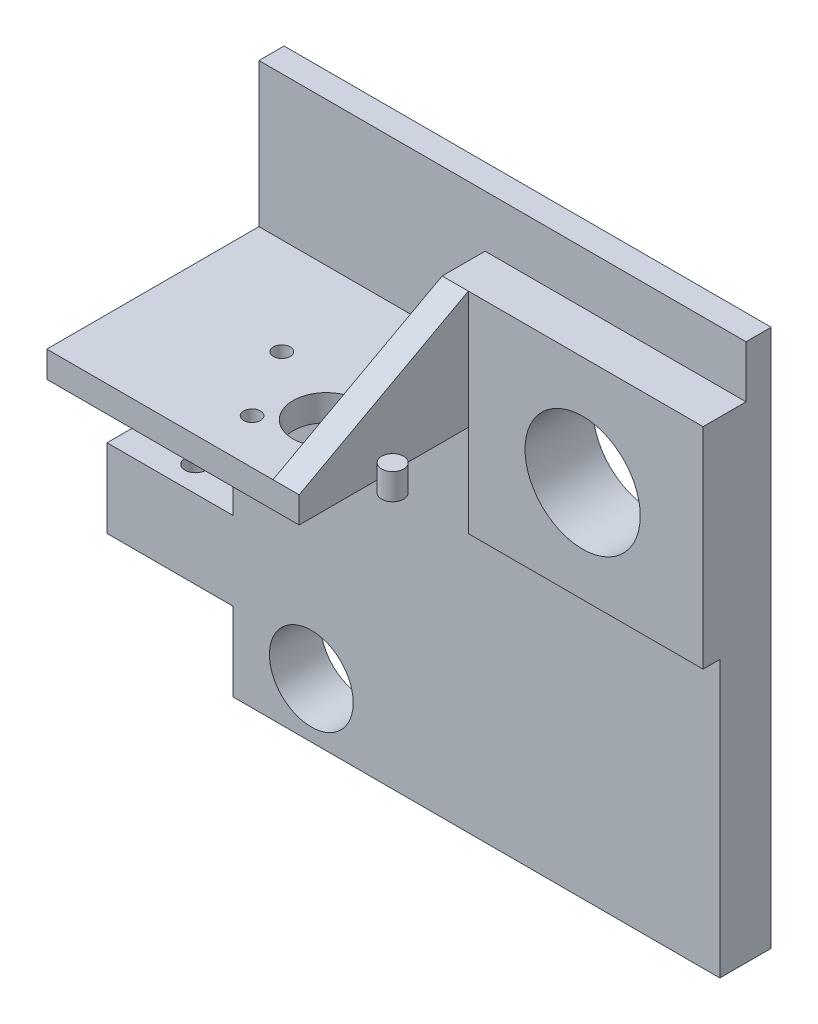
ISO-10303-21;
HEADER;
FILE_DESCRIPTION(('STEP AP214'),'2;1');
FILE_NAME('part.step','',(''),(''),'','','');
FILE_SCHEMA(('AUTOMOTIVE_DESIGN { 1 0 10303 214 1 1 1 1 }'));
ENDSEC;
DATA;
#1=APPLICATION_CONTEXT('core data for automotive mechanical design processes');
#2=APPLICATION_PROTOCOL_DEFINITION('international standard','automotive_design',2000,#1);
#3=PRODUCT_CONTEXT('',#1,'mechanical');
#4=PRODUCT('Part','Part','',(#3));
#5=PRODUCT_RELATED_PRODUCT_CATEGORY('part','',(#4));
#6=PRODUCT_DEFINITION_FORMATION('','',#4);
#7=PRODUCT_DEFINITION_CONTEXT('part definition',#1,'design');
#8=PRODUCT_DEFINITION('design','',#6,#7);
#9=PRODUCT_DEFINITION_SHAPE('','',#8);
#10=(LENGTH_UNIT() NAMED_UNIT(*) SI_UNIT(.MILLI.,.METRE.));
#11=(NAMED_UNIT(*) PLANE_ANGLE_UNIT() SI_UNIT($,.RADIAN.));
#12=(NAMED_UNIT(*) SI_UNIT($,.STERADIAN.) SOLID_ANGLE_UNIT());
#13=UNCERTAINTY_MEASURE_WITH_UNIT(LENGTH_MEASURE(1.E-05),#10,'distance_accuracy_value','');
#14=(GEOMETRIC_REPRESENTATION_CONTEXT(3) GLOBAL_UNCERTAINTY_ASSIGNED_CONTEXT((#13)) GLOBAL_UNIT_ASSIGNED_CONTEXT((#10,
#11,#12)) REPRESENTATION_CONTEXT('',''));
#15=CARTESIAN_POINT('',(0.,0.,0.));
#16=DIRECTION('',(0.,0.,1.));
#17=DIRECTION('',(1.,0.,0.));
#18=AXIS2_PLACEMENT_3D('',#15,#16,#17);
#19=CARTESIAN_POINT('',(51.783815806264,70.2347169301738,31.0499999999999));
#20=DIRECTION('',(0.,1.,0.));
#21=DIRECTION('',(0.,0.,1.));
#22=AXIS2_PLACEMENT_3D('',#19,#20,#21);
#23=CYLINDRICAL_SURFACE('',#22,2.1);
#24=CARTESIAN_POINT('',(51.783815806264,70.2347169301738,31.0499999999999));
#25=DIRECTION('',(0.,-1.,0.));
#26=DIRECTION('',(0.,0.,-1.));
#27=AXIS2_PLACEMENT_3D('',#24,#25,#26);
#28=CIRCLE('',#27,2.1);
#29=CARTESIAN_POINT('',(51.783815806264,70.2347169301738,28.9499999999999));
#30=VERTEX_POINT('',#29);
#31=EDGE_CURVE('E11',#30,#30,#28,.F.);
#32=ORIENTED_EDGE('',*,*,#31,.T.);
#33=EDGE_LOOP('',(#32));
#34=FACE_BOUND('',#33,.T.);
#35=CARTESIAN_POINT('',(51.783815806264,75.2347169301738,31.0499999999999));
#36=DIRECTION('',(0.,-1.,0.));
#37=DIRECTION('',(0.,0.,-1.));
#38=AXIS2_PLACEMENT_3D('',#35,#36,#37);
#39=CIRCLE('',#38,2.1);
#40=CARTESIAN_POINT('',(51.783815806264,75.2347169301738,28.9499999999999));
#41=VERTEX_POINT('',#40);
#42=EDGE_CURVE('E46',#41,#41,#39,.F.);
#43=ORIENTED_EDGE('',*,*,#42,.F.);
#44=EDGE_LOOP('',(#43));
#45=FACE_BOUND('',#44,.T.);
#46=ADVANCED_FACE('F43',(#34,#45),#23,.T.);
#47=CARTESIAN_POINT('',(0.,70.2347169301738,0.));
#48=DIRECTION('',(0.,-1.,0.));
#49=DIRECTION('',(0.,0.,-1.));
#50=AXIS2_PLACEMENT_3D('',#47,#48,#49);
#51=PLANE('',#50);
#52=ORIENTED_EDGE('',*,*,#31,.F.);
#53=EDGE_LOOP('',(#52));
#54=FACE_BOUND('',#53,.T.);
#55=ADVANCED_FACE('F58',(#54),#51,.T.);
#56=CARTESIAN_POINT('',(0.,75.2347169301738,0.));
#57=DIRECTION('',(0.,-1.,0.));
#58=DIRECTION('',(0.,0.,-1.));
#59=AXIS2_PLACEMENT_3D('',#56,#57,#58);
#60=PLANE('',#59);
#61=ORIENTED_EDGE('',*,*,#42,.T.);
#62=EDGE_LOOP('',(#61));
#63=FACE_BOUND('',#62,.T.);
#64=ADVANCED_FACE('F55',(#63),#60,.F.);
#65=CLOSED_SHELL('',(#46,#55,#64));
#66=MANIFOLD_SOLID_BREP('B2',#65);
#67=CARTESIAN_POINT('',(0.,0.,4.8));
#68=DIRECTION('',(0.,0.,1.));
#69=DIRECTION('',(1.,0.,0.));
#70=AXIS2_PLACEMENT_3D('',#67,#68,#69);
#71=PLANE('',#70);
#72=DIRECTION('',(0.,1.,0.));
#73=VECTOR('',#72,1.);
#74=CARTESIAN_POINT('',(43.1785673072466,92.7631774285374,4.80000000000001));
#75=LINE('',#74,#73);
#76=CARTESIAN_POINT('',(43.1785673072466,75.2347169301738,4.80000000000001));
#77=VERTEX_POINT('',#76);
#78=CARTESIAN_POINT('',(43.1785673072466,92.7631774285374,4.80000000000001));
#79=VERTEX_POINT('',#78);
#80=EDGE_CURVE('E253',#77,#79,#75,.T.);
#81=ORIENTED_EDGE('',*,*,#80,.T.);
#82=DIRECTION('',(1.,0.,0.));
#83=VECTOR('',#82,1.);
#84=CARTESIAN_POINT('',(0.,92.7631774285374,4.8));
#85=LINE('',#84,#83);
#86=CARTESIAN_POINT('',(93.,92.7631774285374,4.79999999999999));
#87=VERTEX_POINT('',#86);
#88=EDGE_CURVE('E321',#79,#87,#85,.T.);
#89=ORIENTED_EDGE('',*,*,#88,.T.);
#90=DIRECTION('',(0.,1.,0.));
#91=VECTOR('',#90,1.);
#92=CARTESIAN_POINT('',(93.0000000000001,0.,4.79999999999999));
#93=LINE('',#92,#91);
#94=CARTESIAN_POINT('',(93.,102.7,4.8));
#95=VERTEX_POINT('',#94);
#96=EDGE_CURVE('E346',#87,#95,#93,.T.);
#97=ORIENTED_EDGE('',*,*,#96,.T.);
#98=DIRECTION('',(-1.,0.,0.));
#99=VECTOR('',#98,1.);
#100=CARTESIAN_POINT('',(0.,102.7,4.8));
#101=LINE('',#100,#99);
#102=CARTESIAN_POINT('',(0.,102.7,4.8));
#103=VERTEX_POINT('',#102);
#104=EDGE_CURVE('E348',#95,#103,#101,.T.);
#105=ORIENTED_EDGE('',*,*,#104,.T.);
#106=DIRECTION('',(0.,-1.,0.));
#107=VECTOR('',#106,1.);
#108=CARTESIAN_POINT('',(0.,0.,4.8));
#109=LINE('',#108,#107);
#110=CARTESIAN_POINT('',(0.,75.2347169301738,4.80000000000001));
#111=VERTEX_POINT('',#110);
#112=EDGE_CURVE('E351',#103,#111,#109,.T.);
#113=ORIENTED_EDGE('',*,*,#112,.T.);
#114=DIRECTION('',(1.,0.,0.));
#115=VECTOR('',#114,1.);
#116=CARTESIAN_POINT('',(0.,75.2347169301738,4.80000000000001));
#117=LINE('',#116,#115);
#118=EDGE_CURVE('E278',#111,#77,#117,.T.);
#119=ORIENTED_EDGE('',*,*,#118,.T.);
#120=EDGE_LOOP('',(#81,#89,#97,#105,#113,#119));
#121=FACE_BOUND('',#120,.T.);
#122=ADVANCED_FACE('F84',(#121),#71,.T.);
#123=CARTESIAN_POINT('',(0.,0.,4.8));
#124=DIRECTION('',(1.,0.,0.));
#125=DIRECTION('',(0.,1.,0.));
#126=AXIS2_PLACEMENT_3D('',#123,#124,#125);
#127=PLANE('',#126);
#128=DIRECTION('',(0.,-1.,0.));
#129=VECTOR('',#128,1.);
#130=CARTESIAN_POINT('',(0.,0.,0.));
#131=LINE('',#130,#129);
#132=CARTESIAN_POINT('',(0.,15.,0.));
#133=VERTEX_POINT('',#132);
#134=CARTESIAN_POINT('',(0.,0.,0.));
#135=VERTEX_POINT('',#134);
#136=EDGE_CURVE('E345',#133,#135,#131,.T.);
#137=ORIENTED_EDGE('',*,*,#136,.T.);
#138=DIRECTION('',(0.,0.,-1.));
#139=VECTOR('',#138,1.);
#140=CARTESIAN_POINT('',(0.,0.,4.8));
#141=LINE('',#140,#139);
#142=CARTESIAN_POINT('',(0.,0.,9.8));
#143=VERTEX_POINT('',#142);
#144=EDGE_CURVE('E394',#143,#135,#141,.T.);
#145=ORIENTED_EDGE('',*,*,#144,.F.);
#146=DIRECTION('',(0.,-1.,0.));
#147=VECTOR('',#146,1.);
#148=CARTESIAN_POINT('',(0.,0.,9.8));
#149=LINE('',#148,#147);
#150=CARTESIAN_POINT('',(0.,15.,9.8));
#151=VERTEX_POINT('',#150);
#152=EDGE_CURVE('E230',#151,#143,#149,.T.);
#153=ORIENTED_EDGE('',*,*,#152,.F.);
#154=DIRECTION('',(0.,0.,-1.));
#155=VECTOR('',#154,1.);
#156=CARTESIAN_POINT('',(0.,15.,4.8));
#157=LINE('',#156,#155);
#158=EDGE_CURVE('E354',#151,#133,#157,.T.);
#159=ORIENTED_EDGE('',*,*,#158,.T.);
#160=EDGE_LOOP('',(#137,#145,#153,#159));
#161=FACE_BOUND('',#160,.T.);
#162=ADVANCED_FACE('F86',(#161),#127,.F.);
#163=CARTESIAN_POINT('',(0.,0.,4.8));
#164=DIRECTION('',(0.,1.,0.));
#165=DIRECTION('',(-1.,0.,0.));
#166=AXIS2_PLACEMENT_3D('',#163,#164,#165);
#167=PLANE('',#166);
#168=DIRECTION('',(1.,0.,0.));
#169=VECTOR('',#168,1.);
#170=CARTESIAN_POINT('',(0.,0.,0.));
#171=LINE('',#170,#169);
#172=CARTESIAN_POINT('',(93.0000000000001,0.,0.));
#173=VERTEX_POINT('',#172);
#174=EDGE_CURVE('E357',#135,#173,#171,.T.);
#175=ORIENTED_EDGE('',*,*,#174,.T.);
#176=DIRECTION('',(0.,0.,-1.));
#177=VECTOR('',#176,1.);
#178=CARTESIAN_POINT('',(93.0000000000001,0.,4.79999999999999));
#179=LINE('',#178,#177);
#180=CARTESIAN_POINT('',(93.0000000000004,0.,9.8));
#181=VERTEX_POINT('',#180);
#182=EDGE_CURVE('E391',#181,#173,#179,.T.);
#183=ORIENTED_EDGE('',*,*,#182,.F.);
#184=DIRECTION('',(1.00000000000001,0.,0.));
#185=VECTOR('',#184,1.);
#186=CARTESIAN_POINT('',(0.,0.,9.8));
#187=LINE('',#186,#185);
#188=EDGE_CURVE('E310',#143,#181,#187,.T.);
#189=ORIENTED_EDGE('',*,*,#188,.F.);
#190=ORIENTED_EDGE('',*,*,#144,.T.);
#191=EDGE_LOOP('',(#175,#183,#189,#190));
#192=FACE_BOUND('',#191,.T.);
#193=ADVANCED_FACE('F456',(#192),#167,.F.);
#194=CARTESIAN_POINT('',(93.0000000000001,0.,4.79999999999999));
#195=DIRECTION('',(-1.,0.,0.));
#196=DIRECTION('',(0.,-1.,0.));
#197=AXIS2_PLACEMENT_3D('',#194,#195,#196);
#198=PLANE('',#197);
#199=DIRECTION('',(0.,1.,0.));
#200=VECTOR('',#199,1.);
#201=CARTESIAN_POINT('',(93.0000000000001,0.,0.));
#202=LINE('',#201,#200);
#203=CARTESIAN_POINT('',(93.,102.7,0.));
#204=VERTEX_POINT('',#203);
#205=EDGE_CURVE('E359',#173,#204,#202,.T.);
#206=ORIENTED_EDGE('',*,*,#205,.T.);
#207=DIRECTION('',(0.,0.,-1.));
#208=VECTOR('',#207,1.);
#209=CARTESIAN_POINT('',(93.,102.7,4.8));
#210=LINE('',#209,#208);
#211=EDGE_CURVE('E388',#95,#204,#210,.T.);
#212=ORIENTED_EDGE('',*,*,#211,.F.);
#213=ORIENTED_EDGE('',*,*,#96,.F.);
#214=DIRECTION('',(0.,0.,-1.));
#215=VECTOR('',#214,1.);
#216=CARTESIAN_POINT('',(93.0000000000001,92.7631774285374,13.));
#217=LINE('',#216,#215);
#218=CARTESIAN_POINT('',(93.0000000000001,92.7631774285374,13.));
#219=VERTEX_POINT('',#218);
#220=EDGE_CURVE('E335',#219,#87,#217,.T.);
#221=ORIENTED_EDGE('',*,*,#220,.F.);
#222=DIRECTION('',(0.,1.,0.));
#223=VECTOR('',#222,1.);
#224=CARTESIAN_POINT('',(93.0000000000001,0.,13.));
#225=LINE('',#224,#223);
#226=CARTESIAN_POINT('',(93.0000000000001,52.6660119943756,13.));
#227=VERTEX_POINT('',#226);
#228=EDGE_CURVE('E330',#227,#219,#225,.T.);
#229=ORIENTED_EDGE('',*,*,#228,.F.);
#230=DIRECTION('',(0.,0.,-1.));
#231=VECTOR('',#230,1.);
#232=CARTESIAN_POINT('',(93.0000000000001,52.6660119943756,13.));
#233=LINE('',#232,#231);
#234=CARTESIAN_POINT('',(93.0000000000001,52.6660119943756,9.8));
#235=VERTEX_POINT('',#234);
#236=EDGE_CURVE('E339',#227,#235,#233,.T.);
#237=ORIENTED_EDGE('',*,*,#236,.T.);
#238=DIRECTION('',(0.,1.,0.));
#239=VECTOR('',#238,1.);
#240=CARTESIAN_POINT('',(93.0000000000004,0.,9.8));
#241=LINE('',#240,#239);
#242=EDGE_CURVE('E228',#181,#235,#241,.T.);
#243=ORIENTED_EDGE('',*,*,#242,.F.);
#244=ORIENTED_EDGE('',*,*,#182,.T.);
#245=EDGE_LOOP('',(#206,#212,#213,#221,#229,#237,#243,#244));
#246=FACE_BOUND('',#245,.T.);
#247=ADVANCED_FACE('F491',(#246),#198,.F.);
#248=CARTESIAN_POINT('',(0.,102.7,4.8));
#249=DIRECTION('',(0.,-1.,0.));
#250=DIRECTION('',(1.,0.,0.));
#251=AXIS2_PLACEMENT_3D('',#248,#249,#250);
#252=PLANE('',#251);
#253=DIRECTION('',(-1.,0.,0.));
#254=VECTOR('',#253,1.);
#255=CARTESIAN_POINT('',(0.,102.7,0.));
#256=LINE('',#255,#254);
#257=CARTESIAN_POINT('',(0.,102.7,0.));
#258=VERTEX_POINT('',#257);
#259=EDGE_CURVE('E361',#204,#258,#256,.T.);
#260=ORIENTED_EDGE('',*,*,#259,.T.);
#261=DIRECTION('',(0.,0.,-1.));
#262=VECTOR('',#261,1.);
#263=CARTESIAN_POINT('',(0.,102.7,4.8));
#264=LINE('',#263,#262);
#265=EDGE_CURVE('E385',#103,#258,#264,.T.);
#266=ORIENTED_EDGE('',*,*,#265,.F.);
#267=ORIENTED_EDGE('',*,*,#104,.F.);
#268=ORIENTED_EDGE('',*,*,#211,.T.);
#269=EDGE_LOOP('',(#260,#266,#267,#268));
#270=FACE_BOUND('',#269,.T.);
#271=ADVANCED_FACE('F488',(#270),#252,.F.);
#272=CARTESIAN_POINT('',(0.,0.,4.8));
#273=DIRECTION('',(1.,0.,0.));
#274=DIRECTION('',(0.,1.,0.));
#275=AXIS2_PLACEMENT_3D('',#272,#273,#274);
#276=PLANE('',#275);
#277=DIRECTION('',(0.,-1.,0.));
#278=VECTOR('',#277,1.);
#279=CARTESIAN_POINT('',(0.,0.,0.));
#280=LINE('',#279,#278);
#281=CARTESIAN_POINT('',(0.,30.,0.));
#282=VERTEX_POINT('',#281);
#283=EDGE_CURVE('E363',#258,#282,#280,.T.);
#284=ORIENTED_EDGE('',*,*,#283,.T.);
#285=DIRECTION('',(0.,0.,-1.));
#286=VECTOR('',#285,1.);
#287=CARTESIAN_POINT('',(0.,30.,4.8));
#288=LINE('',#287,#286);
#289=CARTESIAN_POINT('',(0.,30.,9.8));
#290=VERTEX_POINT('',#289);
#291=EDGE_CURVE('E223',#290,#282,#288,.T.);
#292=ORIENTED_EDGE('',*,*,#291,.F.);
#293=CARTESIAN_POINT('',(0.,70.2347169301738,9.8));
#294=VERTEX_POINT('',#293);
#295=EDGE_CURVE('E218',#294,#290,#149,.T.);
#296=ORIENTED_EDGE('',*,*,#295,.F.);
#297=DIRECTION('',(0.,0.,1.));
#298=VECTOR('',#297,1.);
#299=CARTESIAN_POINT('',(0.,70.2347169301738,0.));
#300=LINE('',#299,#298);
#301=CARTESIAN_POINT('',(0.,70.2347169301738,45.3));
#302=VERTEX_POINT('',#301);
#303=EDGE_CURVE('E220',#294,#302,#300,.T.);
#304=ORIENTED_EDGE('',*,*,#303,.T.);
#305=DIRECTION('',(0.,1.,0.));
#306=VECTOR('',#305,1.);
#307=CARTESIAN_POINT('',(0.,70.2347169301738,45.3));
#308=LINE('',#307,#306);
#309=CARTESIAN_POINT('',(0.,75.2347169301738,45.3));
#310=VERTEX_POINT('',#309);
#311=EDGE_CURVE('E235',#302,#310,#308,.T.);
#312=ORIENTED_EDGE('',*,*,#311,.T.);
#313=DIRECTION('',(0.,0.,1.));
#314=VECTOR('',#313,1.);
#315=CARTESIAN_POINT('',(0.,75.2347169301738,0.));
#316=LINE('',#315,#314);
#317=EDGE_CURVE('E298',#111,#310,#316,.T.);
#318=ORIENTED_EDGE('',*,*,#317,.F.);
#319=ORIENTED_EDGE('',*,*,#112,.F.);
#320=ORIENTED_EDGE('',*,*,#265,.T.);
#321=EDGE_LOOP('',(#284,#292,#296,#304,#312,#318,#319,#320));
#322=FACE_BOUND('',#321,.T.);
#323=ADVANCED_FACE('F219',(#322),#276,.F.);
#324=CARTESIAN_POINT('',(1.21430643317358E-13,30.,4.8));
#325=DIRECTION('',(0.,-1.,0.));
#326=DIRECTION('',(1.,0.,0.));
#327=AXIS2_PLACEMENT_3D('',#324,#325,#326);
#328=PLANE('',#327);
#329=CARTESIAN_POINT('',(-11.9999999999999,30.0000000000001,4.9));
#330=DIRECTION('',(0.,1.,0.));
#331=DIRECTION('',(-1.,0.,0.));
#332=AXIS2_PLACEMENT_3D('',#329,#330,#331);
#333=CIRCLE('',#332,2.);
#334=CARTESIAN_POINT('',(-13.9999999999999,30.0000000000001,4.9));
#335=VERTEX_POINT('',#334);
#336=EDGE_CURVE('E247',#335,#335,#333,.T.);
#337=ORIENTED_EDGE('',*,*,#336,.F.);
#338=EDGE_LOOP('',(#337));
#339=FACE_BOUND('',#338,.T.);
#340=DIRECTION('',(-1.,0.,0.));
#341=VECTOR('',#340,1.);
#342=CARTESIAN_POINT('',(1.21430643317358E-13,30.,0.));
#343=LINE('',#342,#341);
#344=CARTESIAN_POINT('',(-24.,30.0000000000001,0.));
#345=VERTEX_POINT('',#344);
#346=EDGE_CURVE('E365',#282,#345,#343,.T.);
#347=ORIENTED_EDGE('',*,*,#346,.T.);
#348=DIRECTION('',(0.,0.,-1.));
#349=VECTOR('',#348,1.);
#350=CARTESIAN_POINT('',(-24.,30.0000000000001,4.8));
#351=LINE('',#350,#349);
#352=CARTESIAN_POINT('',(-24.,30.0000000000001,9.8));
#353=VERTEX_POINT('',#352);
#354=EDGE_CURVE('E381',#353,#345,#351,.T.);
#355=ORIENTED_EDGE('',*,*,#354,.F.);
#356=DIRECTION('',(-1.,0.,0.));
#357=VECTOR('',#356,1.);
#358=CARTESIAN_POINT('',(1.21430643318376E-13,30.,9.8));
#359=LINE('',#358,#357);
#360=EDGE_CURVE('E227',#290,#353,#359,.T.);
#361=ORIENTED_EDGE('',*,*,#360,.F.);
#362=ORIENTED_EDGE('',*,*,#291,.T.);
#363=EDGE_LOOP('',(#347,#355,#361,#362));
#364=FACE_BOUND('',#363,.T.);
#365=ADVANCED_FACE('F481',(#339,#364),#328,.F.);
#366=CARTESIAN_POINT('',(-23.9999999999999,0.,4.8));
#367=DIRECTION('',(1.,0.,0.));
#368=DIRECTION('',(0.,1.,0.));
#369=AXIS2_PLACEMENT_3D('',#366,#367,#368);
#370=PLANE('',#369);
#371=DIRECTION('',(0.,-1.,0.));
#372=VECTOR('',#371,1.);
#373=CARTESIAN_POINT('',(-23.9999999999999,0.,0.));
#374=LINE('',#373,#372);
#375=CARTESIAN_POINT('',(-23.9999999999999,15.,0.));
#376=VERTEX_POINT('',#375);
#377=EDGE_CURVE('E367',#345,#376,#374,.T.);
#378=ORIENTED_EDGE('',*,*,#377,.T.);
#379=DIRECTION('',(0.,0.,-1.));
#380=VECTOR('',#379,1.);
#381=CARTESIAN_POINT('',(-23.9999999999999,15.,4.8));
#382=LINE('',#381,#380);
#383=CARTESIAN_POINT('',(-24.,15.,9.8));
#384=VERTEX_POINT('',#383);
#385=EDGE_CURVE('E378',#384,#376,#382,.T.);
#386=ORIENTED_EDGE('',*,*,#385,.F.);
#387=DIRECTION('',(0.,-1.,0.));
#388=VECTOR('',#387,1.);
#389=CARTESIAN_POINT('',(-23.9999999999999,0.,9.8));
#390=LINE('',#389,#388);
#391=EDGE_CURVE('E315',#353,#384,#390,.T.);
#392=ORIENTED_EDGE('',*,*,#391,.F.);
#393=ORIENTED_EDGE('',*,*,#354,.T.);
#394=EDGE_LOOP('',(#378,#386,#392,#393));
#395=FACE_BOUND('',#394,.T.);
#396=ADVANCED_FACE('F474',(#395),#370,.F.);
#397=CARTESIAN_POINT('',(70.,72.0000000000001,4.8));
#398=DIRECTION('',(0.,0.,-1.));
#399=DIRECTION('',(-1.,0.,0.));
#400=AXIS2_PLACEMENT_3D('',#397,#398,#399);
#401=CYLINDRICAL_SURFACE('',#400,11.);
#402=CARTESIAN_POINT('',(70.,72.0000000000001,0.));
#403=DIRECTION('',(0.,0.,1.));
#404=DIRECTION('',(1.,0.,0.));
#405=AXIS2_PLACEMENT_3D('',#402,#403,#404);
#406=CIRCLE('',#405,11.);
#407=CARTESIAN_POINT('',(81.,72.0000000000001,0.));
#408=VERTEX_POINT('',#407);
#409=EDGE_CURVE('E371',#408,#408,#406,.T.);
#410=ORIENTED_EDGE('',*,*,#409,.F.);
#411=EDGE_LOOP('',(#410));
#412=FACE_BOUND('',#411,.T.);
#413=CARTESIAN_POINT('',(70.0000000000001,72.0000000000001,13.));
#414=DIRECTION('',(0.,0.,1.));
#415=DIRECTION('',(1.,0.,0.));
#416=AXIS2_PLACEMENT_3D('',#413,#414,#415);
#417=CIRCLE('',#416,11.);
#418=CARTESIAN_POINT('',(81.0000000000001,72.0000000000001,13.));
#419=VERTEX_POINT('',#418);
#420=EDGE_CURVE('E322',#419,#419,#417,.F.);
#421=ORIENTED_EDGE('',*,*,#420,.F.);
#422=EDGE_LOOP('',(#421));
#423=FACE_BOUND('',#422,.T.);
#424=ADVANCED_FACE('F471',(#412,#423),#401,.F.);
#425=CARTESIAN_POINT('',(0.,15.,4.8));
#426=DIRECTION('',(0.,1.,0.));
#427=DIRECTION('',(-1.,0.,0.));
#428=AXIS2_PLACEMENT_3D('',#425,#426,#427);
#429=PLANE('',#428);
#430=CARTESIAN_POINT('',(-12.,15.,4.9));
#431=DIRECTION('',(0.,1.,0.));
#432=DIRECTION('',(-1.,0.,0.));
#433=AXIS2_PLACEMENT_3D('',#430,#431,#432);
#434=CIRCLE('',#433,2.);
#435=CARTESIAN_POINT('',(-14.,15.,4.9));
#436=VERTEX_POINT('',#435);
#437=EDGE_CURVE('E88',#436,#436,#434,.T.);
#438=ORIENTED_EDGE('',*,*,#437,.T.);
#439=EDGE_LOOP('',(#438));
#440=FACE_BOUND('',#439,.T.);
#441=DIRECTION('',(1.,0.,0.));
#442=VECTOR('',#441,1.);
#443=CARTESIAN_POINT('',(0.,15.,0.));
#444=LINE('',#443,#442);
#445=EDGE_CURVE('E369',#376,#133,#444,.T.);
#446=ORIENTED_EDGE('',*,*,#445,.T.);
#447=ORIENTED_EDGE('',*,*,#158,.F.);
#448=DIRECTION('',(1.,0.,0.));
#449=VECTOR('',#448,1.);
#450=CARTESIAN_POINT('',(0.,15.,9.8));
#451=LINE('',#450,#449);
#452=EDGE_CURVE('E307',#384,#151,#451,.T.);
#453=ORIENTED_EDGE('',*,*,#452,.F.);
#454=ORIENTED_EDGE('',*,*,#385,.T.);
#455=EDGE_LOOP('',(#446,#447,#453,#454));
#456=FACE_BOUND('',#455,.T.);
#457=ADVANCED_FACE('F469',(#440,#456),#429,.F.);
#458=CARTESIAN_POINT('',(15.0000000000003,10.5,4.8));
#459=DIRECTION('',(0.,0.,-1.));
#460=DIRECTION('',(-1.,0.,0.));
#461=AXIS2_PLACEMENT_3D('',#458,#459,#460);
#462=CYLINDRICAL_SURFACE('',#461,8.);
#463=CARTESIAN_POINT('',(15.0000000000003,10.5,0.));
#464=DIRECTION('',(0.,0.,1.00000000000002));
#465=DIRECTION('',(1.00000000000002,0.,0.));
#466=AXIS2_PLACEMENT_3D('',#463,#464,#465);
#467=CIRCLE('',#466,8.);
#468=CARTESIAN_POINT('',(23.0000000000005,10.5,0.));
#469=VERTEX_POINT('',#468);
#470=EDGE_CURVE('E349',#469,#469,#467,.T.);
#471=ORIENTED_EDGE('',*,*,#470,.F.);
#472=EDGE_LOOP('',(#471));
#473=FACE_BOUND('',#472,.T.);
#474=CARTESIAN_POINT('',(15.0000000000004,10.5,9.80000000000001));
#475=DIRECTION('',(0.,0.,1.00000000000001));
#476=DIRECTION('',(1.00000000000001,0.,0.));
#477=AXIS2_PLACEMENT_3D('',#474,#475,#476);
#478=CIRCLE('',#477,8.);
#479=CARTESIAN_POINT('',(23.0000000000005,10.5,9.80000000000001));
#480=VERTEX_POINT('',#479);
#481=EDGE_CURVE('E318',#480,#480,#478,.F.);
#482=ORIENTED_EDGE('',*,*,#481,.F.);
#483=EDGE_LOOP('',(#482));
#484=FACE_BOUND('',#483,.T.);
#485=ADVANCED_FACE('F465',(#473,#484),#462,.F.);
#486=CARTESIAN_POINT('',(0.,0.,0.));
#487=DIRECTION('',(0.,0.,1.));
#488=DIRECTION('',(1.,0.,0.));
#489=AXIS2_PLACEMENT_3D('',#486,#487,#488);
#490=PLANE('',#489);
#491=ORIENTED_EDGE('',*,*,#136,.F.);
#492=ORIENTED_EDGE('',*,*,#445,.F.);
#493=ORIENTED_EDGE('',*,*,#377,.F.);
#494=ORIENTED_EDGE('',*,*,#346,.F.);
#495=ORIENTED_EDGE('',*,*,#283,.F.);
#496=ORIENTED_EDGE('',*,*,#259,.F.);
#497=ORIENTED_EDGE('',*,*,#205,.F.);
#498=ORIENTED_EDGE('',*,*,#174,.F.);
#499=EDGE_LOOP('',(#491,#492,#493,#494,#495,#496,#497,#498));
#500=FACE_BOUND('',#499,.T.);
#501=ORIENTED_EDGE('',*,*,#409,.T.);
#502=EDGE_LOOP('',(#501));
#503=FACE_BOUND('',#502,.T.);
#504=ORIENTED_EDGE('',*,*,#470,.T.);
#505=EDGE_LOOP('',(#504));
#506=FACE_BOUND('',#505,.T.);
#507=ADVANCED_FACE('F462',(#500,#503,#506),#490,.F.);
#508=CARTESIAN_POINT('',(48.1785673072466,0.,13.));
#509=DIRECTION('',(1.,0.,0.));
#510=DIRECTION('',(0.,1.,0.));
#511=AXIS2_PLACEMENT_3D('',#508,#509,#510);
#512=PLANE('',#511);
#513=DIRECTION('',(0.,0.,1.));
#514=VECTOR('',#513,1.);
#515=CARTESIAN_POINT('',(48.1785673072466,70.2347169301738,0.));
#516=LINE('',#515,#514);
#517=CARTESIAN_POINT('',(48.1785673072466,70.2347169301738,9.8));
#518=VERTEX_POINT('',#517);
#519=CARTESIAN_POINT('',(48.1785673072466,70.2347169301738,13.));
#520=VERTEX_POINT('',#519);
#521=EDGE_CURVE('E104',#518,#520,#516,.T.);
#522=ORIENTED_EDGE('',*,*,#521,.F.);
#523=DIRECTION('',(0.,1.,0.));
#524=VECTOR('',#523,1.);
#525=CARTESIAN_POINT('',(48.1785673072472,70.2347169301738,9.8));
#526=LINE('',#525,#524);
#527=CARTESIAN_POINT('',(48.1785673072472,52.6660119943756,9.80000000000001));
#528=VERTEX_POINT('',#527);
#529=EDGE_CURVE('E242',#528,#518,#526,.T.);
#530=ORIENTED_EDGE('',*,*,#529,.F.);
#531=DIRECTION('',(0.,0.,-1.));
#532=VECTOR('',#531,1.);
#533=CARTESIAN_POINT('',(48.1785673072466,52.6660119943756,13.));
#534=LINE('',#533,#532);
#535=CARTESIAN_POINT('',(48.1785673072466,52.6660119943756,13.));
#536=VERTEX_POINT('',#535);
#537=EDGE_CURVE('E342',#536,#528,#534,.T.);
#538=ORIENTED_EDGE('',*,*,#537,.F.);
#539=DIRECTION('',(0.,-1.,0.));
#540=VECTOR('',#539,1.);
#541=CARTESIAN_POINT('',(48.1785673072466,0.,13.));
#542=LINE('',#541,#540);
#543=EDGE_CURVE('E325',#520,#536,#542,.T.);
#544=ORIENTED_EDGE('',*,*,#543,.F.);
#545=EDGE_LOOP('',(#522,#530,#538,#544));
#546=FACE_BOUND('',#545,.T.);
#547=ADVANCED_FACE('F460',(#546),#512,.F.);
#548=CARTESIAN_POINT('',(0.,52.6660119943756,13.));
#549=DIRECTION('',(0.,1.,0.));
#550=DIRECTION('',(-1.,0.,0.));
#551=AXIS2_PLACEMENT_3D('',#548,#549,#550);
#552=PLANE('',#551);
#553=ORIENTED_EDGE('',*,*,#537,.T.);
#554=DIRECTION('',(1.,0.,0.));
#555=VECTOR('',#554,1.);
#556=CARTESIAN_POINT('',(0.,52.6660119943756,9.8));
#557=LINE('',#556,#555);
#558=EDGE_CURVE('E397',#528,#235,#557,.T.);
#559=ORIENTED_EDGE('',*,*,#558,.T.);
#560=ORIENTED_EDGE('',*,*,#236,.F.);
#561=DIRECTION('',(1.,0.,0.));
#562=VECTOR('',#561,1.);
#563=CARTESIAN_POINT('',(0.,52.6660119943756,13.));
#564=LINE('',#563,#562);
#565=EDGE_CURVE('E328',#536,#227,#564,.T.);
#566=ORIENTED_EDGE('',*,*,#565,.F.);
#567=EDGE_LOOP('',(#553,#559,#560,#566));
#568=FACE_BOUND('',#567,.T.);
#569=ADVANCED_FACE('F518',(#568),#552,.F.);
#570=CARTESIAN_POINT('',(0.,92.7631774285374,13.));
#571=DIRECTION('',(0.,1.,0.));
#572=DIRECTION('',(-1.,0.,0.));
#573=AXIS2_PLACEMENT_3D('',#570,#571,#572);
#574=PLANE('',#573);
#575=ORIENTED_EDGE('',*,*,#88,.F.);
#576=DIRECTION('',(0.,0.,1.));
#577=VECTOR('',#576,1.);
#578=CARTESIAN_POINT('',(43.1785673072466,92.7631774285374,13.));
#579=LINE('',#578,#577);
#580=CARTESIAN_POINT('',(43.1785673072466,92.7631774285374,13.));
#581=VERTEX_POINT('',#580);
#582=EDGE_CURVE('E256',#79,#581,#579,.T.);
#583=ORIENTED_EDGE('',*,*,#582,.T.);
#584=DIRECTION('',(1.,0.,0.));
#585=VECTOR('',#584,1.);
#586=CARTESIAN_POINT('',(43.1785673072466,92.7631774285374,13.));
#587=LINE('',#586,#585);
#588=CARTESIAN_POINT('',(48.1785673072466,92.7631774285374,13.));
#589=VERTEX_POINT('',#588);
#590=EDGE_CURVE('E262',#581,#589,#587,.T.);
#591=ORIENTED_EDGE('',*,*,#590,.T.);
#592=DIRECTION('',(1.,0.,0.));
#593=VECTOR('',#592,1.);
#594=CARTESIAN_POINT('',(0.,92.7631774285374,13.));
#595=LINE('',#594,#593);
#596=EDGE_CURVE('E332',#589,#219,#595,.T.);
#597=ORIENTED_EDGE('',*,*,#596,.T.);
#598=ORIENTED_EDGE('',*,*,#220,.T.);
#599=EDGE_LOOP('',(#575,#583,#591,#597,#598));
#600=FACE_BOUND('',#599,.T.);
#601=ADVANCED_FACE('F511',(#600),#574,.T.);
#602=CARTESIAN_POINT('',(0.,0.,13.));
#603=DIRECTION('',(0.,0.,1.));
#604=DIRECTION('',(1.,0.,0.));
#605=AXIS2_PLACEMENT_3D('',#602,#603,#604);
#606=PLANE('',#605);
#607=ORIENTED_EDGE('',*,*,#420,.T.);
#608=EDGE_LOOP('',(#607));
#609=FACE_BOUND('',#608,.T.);
#610=EDGE_CURVE('E326',#589,#520,#542,.T.);
#611=ORIENTED_EDGE('',*,*,#610,.T.);
#612=ORIENTED_EDGE('',*,*,#543,.T.);
#613=ORIENTED_EDGE('',*,*,#565,.T.);
#614=ORIENTED_EDGE('',*,*,#228,.T.);
#615=ORIENTED_EDGE('',*,*,#596,.F.);
#616=EDGE_LOOP('',(#611,#612,#613,#614,#615));
#617=FACE_BOUND('',#616,.T.);
#618=ADVANCED_FACE('F513',(#609,#617),#606,.T.);
#619=CARTESIAN_POINT('',(0.,0.,9.8));
#620=DIRECTION('',(0.,0.,1.));
#621=DIRECTION('',(1.,0.,0.));
#622=AXIS2_PLACEMENT_3D('',#619,#620,#621);
#623=PLANE('',#622);
#624=ORIENTED_EDGE('',*,*,#452,.T.);
#625=ORIENTED_EDGE('',*,*,#152,.T.);
#626=ORIENTED_EDGE('',*,*,#188,.T.);
#627=ORIENTED_EDGE('',*,*,#242,.T.);
#628=ORIENTED_EDGE('',*,*,#558,.F.);
#629=ORIENTED_EDGE('',*,*,#529,.T.);
#630=DIRECTION('',(-1.,0.,0.));
#631=VECTOR('',#630,1.);
#632=CARTESIAN_POINT('',(0.,70.2347169301738,9.8));
#633=LINE('',#632,#631);
#634=EDGE_CURVE('E100',#518,#294,#633,.T.);
#635=ORIENTED_EDGE('',*,*,#634,.T.);
#636=ORIENTED_EDGE('',*,*,#295,.T.);
#637=ORIENTED_EDGE('',*,*,#360,.T.);
#638=ORIENTED_EDGE('',*,*,#391,.T.);
#639=EDGE_LOOP('',(#624,#625,#626,#627,#628,#629,#635,#636,#637,#638));
#640=FACE_BOUND('',#639,.T.);
#641=ORIENTED_EDGE('',*,*,#481,.T.);
#642=EDGE_LOOP('',(#641));
#643=FACE_BOUND('',#642,.T.);
#644=ADVANCED_FACE('F239',(#640,#643),#623,.T.);
#645=CARTESIAN_POINT('',(48.1785673072466,70.2347169301738,0.));
#646=DIRECTION('',(-1.,0.,0.));
#647=DIRECTION('',(0.,-1.,0.));
#648=AXIS2_PLACEMENT_3D('',#645,#646,#647);
#649=PLANE('',#648);
#650=CARTESIAN_POINT('',(48.1785673072466,70.2347169301738,45.3));
#651=VERTEX_POINT('',#650);
#652=EDGE_CURVE('E284',#520,#651,#516,.T.);
#653=ORIENTED_EDGE('',*,*,#652,.F.);
#654=ORIENTED_EDGE('',*,*,#610,.F.);
#655=DIRECTION('',(0.,-0.476969427188847,0.878919885727444));
#656=VECTOR('',#655,1.);
#657=CARTESIAN_POINT('',(48.1785673072466,75.2347169301738,45.3));
#658=LINE('',#657,#656);
#659=CARTESIAN_POINT('',(48.1785673072466,75.2347169301738,45.3));
#660=VERTEX_POINT('',#659);
#661=EDGE_CURVE('E244',#589,#660,#658,.T.);
#662=ORIENTED_EDGE('',*,*,#661,.T.);
#663=DIRECTION('',(0.,1.,0.));
#664=VECTOR('',#663,1.);
#665=CARTESIAN_POINT('',(48.1785673072466,70.2347169301738,45.3));
#666=LINE('',#665,#664);
#667=EDGE_CURVE('E304',#651,#660,#666,.T.);
#668=ORIENTED_EDGE('',*,*,#667,.F.);
#669=EDGE_LOOP('',(#653,#654,#662,#668));
#670=FACE_BOUND('',#669,.T.);
#671=ADVANCED_FACE('F545',(#670),#649,.F.);
#672=CARTESIAN_POINT('',(0.,70.2347169301738,45.3));
#673=DIRECTION('',(0.,0.,1.));
#674=DIRECTION('',(0.,-1.,0.));
#675=AXIS2_PLACEMENT_3D('',#672,#673,#674);
#676=PLANE('',#675);
#677=DIRECTION('',(1.,0.,0.));
#678=VECTOR('',#677,1.);
#679=CARTESIAN_POINT('',(0.,70.2347169301738,45.3));
#680=LINE('',#679,#678);
#681=EDGE_CURVE('E234',#302,#651,#680,.T.);
#682=ORIENTED_EDGE('',*,*,#681,.T.);
#683=ORIENTED_EDGE('',*,*,#667,.T.);
#684=DIRECTION('',(1.,0.,0.));
#685=VECTOR('',#684,1.);
#686=CARTESIAN_POINT('',(43.1785673072466,75.2347169301738,45.3));
#687=LINE('',#686,#685);
#688=CARTESIAN_POINT('',(43.1785673072466,75.2347169301738,45.3));
#689=VERTEX_POINT('',#688);
#690=EDGE_CURVE('E264',#689,#660,#687,.T.);
#691=ORIENTED_EDGE('',*,*,#690,.F.);
#692=DIRECTION('',(1.,0.,0.));
#693=VECTOR('',#692,1.);
#694=CARTESIAN_POINT('',(0.,75.2347169301738,45.3));
#695=LINE('',#694,#693);
#696=EDGE_CURVE('E295',#310,#689,#695,.T.);
#697=ORIENTED_EDGE('',*,*,#696,.F.);
#698=ORIENTED_EDGE('',*,*,#311,.F.);
#699=EDGE_LOOP('',(#682,#683,#691,#697,#698));
#700=FACE_BOUND('',#699,.T.);
#701=ADVANCED_FACE('F415',(#700),#676,.T.);
#702=CARTESIAN_POINT('',(30.610422047605,70.2347169301738,36.7233937586588));
#703=DIRECTION('',(0.,1.,0.));
#704=DIRECTION('',(0.,0.,1.));
#705=AXIS2_PLACEMENT_3D('',#702,#703,#704);
#706=CYLINDRICAL_SURFACE('',#705,1.6);
#707=CARTESIAN_POINT('',(30.610422047605,70.2347169301738,36.7233937586588));
#708=DIRECTION('',(0.,-1.,0.));
#709=DIRECTION('',(0.,0.,-1.));
#710=AXIS2_PLACEMENT_3D('',#707,#708,#709);
#711=CIRCLE('',#710,1.6);
#712=CARTESIAN_POINT('',(30.610422047605,70.2347169301738,35.1233937586588));
#713=VERTEX_POINT('',#712);
#714=EDGE_CURVE('E281',#713,#713,#711,.F.);
#715=ORIENTED_EDGE('',*,*,#714,.F.);
#716=EDGE_LOOP('',(#715));
#717=FACE_BOUND('',#716,.T.);
#718=CARTESIAN_POINT('',(30.610422047605,75.2347169301738,36.7233937586588));
#719=DIRECTION('',(0.,-1.,0.));
#720=DIRECTION('',(0.,0.,-1.));
#721=AXIS2_PLACEMENT_3D('',#718,#719,#720);
#722=CIRCLE('',#721,1.6);
#723=CARTESIAN_POINT('',(30.610422047605,75.2347169301738,35.1233937586588));
#724=VERTEX_POINT('',#723);
#725=EDGE_CURVE('E292',#724,#724,#722,.F.);
#726=ORIENTED_EDGE('',*,*,#725,.T.);
#727=EDGE_LOOP('',(#726));
#728=FACE_BOUND('',#727,.T.);
#729=ADVANCED_FACE('F435',(#717,#728),#706,.F.);
#730=CARTESIAN_POINT('',(22.8604220476051,70.2347169301738,23.3));
#731=DIRECTION('',(0.,1.,0.));
#732=DIRECTION('',(0.,0.,1.));
#733=AXIS2_PLACEMENT_3D('',#730,#731,#732);
#734=CYLINDRICAL_SURFACE('',#733,1.6);
#735=CARTESIAN_POINT('',(22.8604220476051,70.2347169301738,23.3));
#736=DIRECTION('',(0.,-1.,0.));
#737=DIRECTION('',(0.,0.,-1.));
#738=AXIS2_PLACEMENT_3D('',#735,#736,#737);
#739=CIRCLE('',#738,1.6);
#740=CARTESIAN_POINT('',(22.8604220476051,70.2347169301738,21.7));
#741=VERTEX_POINT('',#740);
#742=EDGE_CURVE('E277',#741,#741,#739,.F.);
#743=ORIENTED_EDGE('',*,*,#742,.F.);
#744=EDGE_LOOP('',(#743));
#745=FACE_BOUND('',#744,.T.);
#746=CARTESIAN_POINT('',(22.8604220476051,75.2347169301738,23.3));
#747=DIRECTION('',(0.,-1.,0.));
#748=DIRECTION('',(0.,0.,-1.));
#749=AXIS2_PLACEMENT_3D('',#746,#747,#748);
#750=CIRCLE('',#749,1.6);
#751=CARTESIAN_POINT('',(22.8604220476051,75.2347169301738,21.7));
#752=VERTEX_POINT('',#751);
#753=EDGE_CURVE('E289',#752,#752,#750,.F.);
#754=ORIENTED_EDGE('',*,*,#753,.T.);
#755=EDGE_LOOP('',(#754));
#756=FACE_BOUND('',#755,.T.);
#757=ADVANCED_FACE('F438',(#745,#756),#734,.F.);
#758=CARTESIAN_POINT('',(38.3604220476051,70.2347169301738,30.3));
#759=DIRECTION('',(0.,1.,0.));
#760=DIRECTION('',(0.,0.,1.));
#761=AXIS2_PLACEMENT_3D('',#758,#759,#760);
#762=CYLINDRICAL_SURFACE('',#761,6.35);
#763=DIRECTION('',(0.,1.,0.));
#764=VECTOR('',#763,1.);
#765=CARTESIAN_POINT('',(43.1785673072466,70.2347169301738,34.4361789440248));
#766=LINE('',#765,#764);
#767=CARTESIAN_POINT('',(43.1785673072466,70.2347169301738,34.4361789440248));
#768=VERTEX_POINT('',#767);
#769=CARTESIAN_POINT('',(43.1785673072466,75.2347169301738,34.4361789440248));
#770=VERTEX_POINT('',#769);
#771=EDGE_CURVE('E271',#768,#770,#766,.T.);
#772=ORIENTED_EDGE('',*,*,#771,.F.);
#773=CARTESIAN_POINT('',(38.3604220476051,70.2347169301738,30.3));
#774=DIRECTION('',(0.,-1.,0.));
#775=DIRECTION('',(0.,0.,-1.));
#776=AXIS2_PLACEMENT_3D('',#773,#774,#775);
#777=CIRCLE('',#776,6.35);
#778=CARTESIAN_POINT('',(43.1785673072466,70.2347169301738,26.1638210559752));
#779=VERTEX_POINT('',#778);
#780=EDGE_CURVE('E274',#768,#779,#777,.T.);
#781=ORIENTED_EDGE('',*,*,#780,.T.);
#782=DIRECTION('',(0.,1.,0.));
#783=VECTOR('',#782,1.);
#784=CARTESIAN_POINT('',(43.1785673072466,70.2347169301738,26.1638210559752));
#785=LINE('',#784,#783);
#786=CARTESIAN_POINT('',(43.1785673072466,75.2347169301738,26.1638210559752));
#787=VERTEX_POINT('',#786);
#788=EDGE_CURVE('E267',#787,#779,#785,.F.);
#789=ORIENTED_EDGE('',*,*,#788,.F.);
#790=CARTESIAN_POINT('',(38.3604220476051,75.2347169301738,30.3));
#791=DIRECTION('',(0.,-1.,0.));
#792=DIRECTION('',(0.,0.,-1.));
#793=AXIS2_PLACEMENT_3D('',#790,#791,#792);
#794=CIRCLE('',#793,6.35);
#795=EDGE_CURVE('E273',#770,#787,#794,.T.);
#796=ORIENTED_EDGE('',*,*,#795,.F.);
#797=EDGE_LOOP('',(#772,#781,#789,#796));
#798=FACE_BOUND('',#797,.T.);
#799=ADVANCED_FACE('F427',(#798),#762,.F.);
#800=CARTESIAN_POINT('',(0.,70.2347169301738,0.));
#801=DIRECTION('',(0.,-1.,0.));
#802=DIRECTION('',(0.,0.,-1.));
#803=AXIS2_PLACEMENT_3D('',#800,#801,#802);
#804=PLANE('',#803);
#805=ORIENTED_EDGE('',*,*,#634,.F.);
#806=ORIENTED_EDGE('',*,*,#521,.T.);
#807=ORIENTED_EDGE('',*,*,#652,.T.);
#808=ORIENTED_EDGE('',*,*,#681,.F.);
#809=ORIENTED_EDGE('',*,*,#303,.F.);
#810=EDGE_LOOP('',(#805,#806,#807,#808,#809));
#811=FACE_BOUND('',#810,.T.);
#812=ORIENTED_EDGE('',*,*,#780,.F.);
#813=DIRECTION('',(0.,0.,-1.));
#814=VECTOR('',#813,1.);
#815=CARTESIAN_POINT('',(43.1785673072466,70.2347169301738,4.80000000000001));
#816=LINE('',#815,#814);
#817=EDGE_CURVE('E250',#768,#779,#816,.T.);
#818=ORIENTED_EDGE('',*,*,#817,.T.);
#819=EDGE_LOOP('',(#812,#818));
#820=FACE_BOUND('',#819,.T.);
#821=ORIENTED_EDGE('',*,*,#742,.T.);
#822=EDGE_LOOP('',(#821));
#823=FACE_BOUND('',#822,.T.);
#824=ORIENTED_EDGE('',*,*,#714,.T.);
#825=EDGE_LOOP('',(#824));
#826=FACE_BOUND('',#825,.T.);
#827=ADVANCED_FACE('F232',(#811,#820,#823,#826),#804,.T.);
#828=CARTESIAN_POINT('',(0.,75.2347169301738,0.));
#829=DIRECTION('',(0.,-1.,0.));
#830=DIRECTION('',(0.,0.,-1.));
#831=AXIS2_PLACEMENT_3D('',#828,#829,#830);
#832=PLANE('',#831);
#833=ORIENTED_EDGE('',*,*,#696,.T.);
#834=DIRECTION('',(0.,0.,-1.));
#835=VECTOR('',#834,1.);
#836=CARTESIAN_POINT('',(43.1785673072466,75.2347169301738,0.));
#837=LINE('',#836,#835);
#838=EDGE_CURVE('E41',#689,#770,#837,.T.);
#839=ORIENTED_EDGE('',*,*,#838,.T.);
#840=ORIENTED_EDGE('',*,*,#795,.T.);
#841=EDGE_CURVE('E93',#787,#77,#837,.T.);
#842=ORIENTED_EDGE('',*,*,#841,.T.);
#843=ORIENTED_EDGE('',*,*,#118,.F.);
#844=ORIENTED_EDGE('',*,*,#317,.T.);
#845=EDGE_LOOP('',(#833,#839,#840,#842,#843,#844));
#846=FACE_BOUND('',#845,.T.);
#847=ORIENTED_EDGE('',*,*,#753,.F.);
#848=EDGE_LOOP('',(#847));
#849=FACE_BOUND('',#848,.T.);
#850=ORIENTED_EDGE('',*,*,#725,.F.);
#851=EDGE_LOOP('',(#850));
#852=FACE_BOUND('',#851,.T.);
#853=ADVANCED_FACE('F401',(#846,#849,#852),#832,.F.);
#854=CARTESIAN_POINT('',(43.1785673072466,0.,0.));
#855=DIRECTION('',(-1.,0.,0.));
#856=DIRECTION('',(0.,0.,1.));
#857=AXIS2_PLACEMENT_3D('',#854,#855,#856);
#858=PLANE('',#857);
#859=ORIENTED_EDGE('',*,*,#817,.F.);
#860=ORIENTED_EDGE('',*,*,#771,.T.);
#861=ORIENTED_EDGE('',*,*,#838,.F.);
#862=DIRECTION('',(0.,-0.476969427188847,0.878919885727444));
#863=VECTOR('',#862,1.);
#864=CARTESIAN_POINT('',(43.1785673072466,75.2347169301738,45.3));
#865=LINE('',#864,#863);
#866=EDGE_CURVE('E259',#581,#689,#865,.T.);
#867=ORIENTED_EDGE('',*,*,#866,.F.);
#868=ORIENTED_EDGE('',*,*,#582,.F.);
#869=ORIENTED_EDGE('',*,*,#80,.F.);
#870=ORIENTED_EDGE('',*,*,#841,.F.);
#871=ORIENTED_EDGE('',*,*,#788,.T.);
#872=EDGE_LOOP('',(#859,#860,#861,#867,#868,#869,#870,#871));
#873=FACE_BOUND('',#872,.T.);
#874=ADVANCED_FACE('F423',(#873),#858,.T.);
#875=CARTESIAN_POINT('',(43.1785673072466,75.2347169301738,45.3));
#876=DIRECTION('',(0.,0.878919885727444,0.476969427188847));
#877=DIRECTION('',(0.,-0.476969427188847,0.878919885727444));
#878=AXIS2_PLACEMENT_3D('',#875,#876,#877);
#879=PLANE('',#878);
#880=ORIENTED_EDGE('',*,*,#661,.F.);
#881=ORIENTED_EDGE('',*,*,#590,.F.);
#882=ORIENTED_EDGE('',*,*,#866,.T.);
#883=ORIENTED_EDGE('',*,*,#690,.T.);
#884=EDGE_LOOP('',(#880,#881,#882,#883));
#885=FACE_BOUND('',#884,.T.);
#886=ADVANCED_FACE('F419',(#885),#879,.T.);
#887=CARTESIAN_POINT('',(-12.0000000000001,0.,4.9));
#888=DIRECTION('',(0.,1.,0.));
#889=DIRECTION('',(-1.,0.,0.));
#890=AXIS2_PLACEMENT_3D('',#887,#888,#889);
#891=CYLINDRICAL_SURFACE('',#890,2.);
#892=ORIENTED_EDGE('',*,*,#336,.T.);
#893=EDGE_LOOP('',(#892));
#894=FACE_BOUND('',#893,.T.);
#895=ORIENTED_EDGE('',*,*,#437,.F.);
#896=EDGE_LOOP('',(#895));
#897=FACE_BOUND('',#896,.T.);
#898=ADVANCED_FACE('F600',(#894,#897),#891,.F.);
#899=CLOSED_SHELL('',(#122,#162,#193,#247,#271,#323,#365,#396,#424,#457,#485,#507,#547,#569,
#601,#618,#644,#671,#701,#729,#757,#799,#827,#853,#874,#886,#898));
#900=MANIFOLD_SOLID_BREP('B6',#899);
#901=ADVANCED_BREP_SHAPE_REPRESENTATION('',(#18,#66,#900),#14);
#902=SHAPE_DEFINITION_REPRESENTATION(#9,#901);
ENDSEC;
END-ISO-10303-21;
